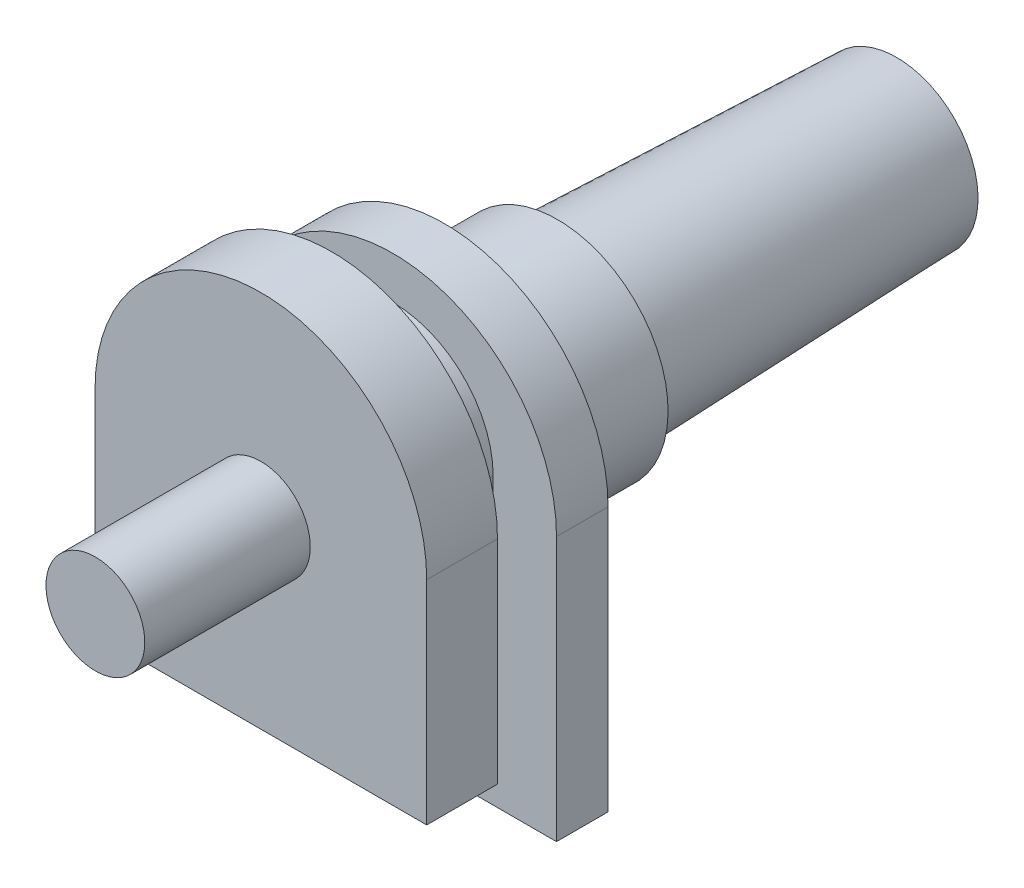
ISO-10303-21;
HEADER;
FILE_DESCRIPTION(('STEP AP214'),'2;1');
FILE_NAME('part.step','',(''),(''),'','','');
FILE_SCHEMA(('AUTOMOTIVE_DESIGN { 1 0 10303 214 1 1 1 1 }'));
ENDSEC;
DATA;
#1=APPLICATION_CONTEXT('core data for automotive mechanical design processes');
#2=APPLICATION_PROTOCOL_DEFINITION('international standard','automotive_design',2000,#1);
#3=PRODUCT_CONTEXT('',#1,'mechanical');
#4=PRODUCT('Part','Part','',(#3));
#5=PRODUCT_RELATED_PRODUCT_CATEGORY('part','',(#4));
#6=PRODUCT_DEFINITION_FORMATION('','',#4);
#7=PRODUCT_DEFINITION_CONTEXT('part definition',#1,'design');
#8=PRODUCT_DEFINITION('design','',#6,#7);
#9=PRODUCT_DEFINITION_SHAPE('','',#8);
#10=(LENGTH_UNIT() NAMED_UNIT(*) SI_UNIT(.MILLI.,.METRE.));
#11=(NAMED_UNIT(*) PLANE_ANGLE_UNIT() SI_UNIT($,.RADIAN.));
#12=(NAMED_UNIT(*) SI_UNIT($,.STERADIAN.) SOLID_ANGLE_UNIT());
#13=UNCERTAINTY_MEASURE_WITH_UNIT(LENGTH_MEASURE(1.E-05),#10,'distance_accuracy_value','');
#14=(GEOMETRIC_REPRESENTATION_CONTEXT(3) GLOBAL_UNCERTAINTY_ASSIGNED_CONTEXT((#13)) GLOBAL_UNIT_ASSIGNED_CONTEXT((#10,
#11,#12)) REPRESENTATION_CONTEXT('',''));
#15=CARTESIAN_POINT('',(0.,0.,0.));
#16=DIRECTION('',(0.,0.,1.));
#17=DIRECTION('',(1.,0.,0.));
#18=AXIS2_PLACEMENT_3D('',#15,#16,#17);
#19=CARTESIAN_POINT('',(0.,0.,0.));
#20=DIRECTION('',(0.,0.,1.));
#21=DIRECTION('',(1.,0.,0.));
#22=AXIS2_PLACEMENT_3D('',#19,#20,#21);
#23=PLANE('',#22);
#24=CARTESIAN_POINT('',(0.,0.,0.));
#25=DIRECTION('',(0.,0.,1.));
#26=DIRECTION('',(1.,0.,0.));
#27=AXIS2_PLACEMENT_3D('',#24,#25,#26);
#28=CIRCLE('',#27,7.335);
#29=CARTESIAN_POINT('',(7.335,0.,0.));
#30=VERTEX_POINT('',#29);
#31=CARTESIAN_POINT('',(-7.335,0.,0.));
#32=VERTEX_POINT('',#31);
#33=EDGE_CURVE('E191',#30,#32,#28,.T.);
#34=ORIENTED_EDGE('',*,*,#33,.F.);
#35=DIRECTION('',(0.,1.,0.));
#36=VECTOR('',#35,1.);
#37=CARTESIAN_POINT('',(7.335,-9.395,0.));
#38=LINE('',#37,#36);
#39=CARTESIAN_POINT('',(7.335,-9.395,0.));
#40=VERTEX_POINT('',#39);
#41=EDGE_CURVE('E196',#40,#30,#38,.T.);
#42=ORIENTED_EDGE('',*,*,#41,.F.);
#43=DIRECTION('',(1.,0.,0.));
#44=VECTOR('',#43,1.);
#45=CARTESIAN_POINT('',(-7.335,-9.395,0.));
#46=LINE('',#45,#44);
#47=CARTESIAN_POINT('',(-7.335,-9.395,0.));
#48=VERTEX_POINT('',#47);
#49=EDGE_CURVE('E207',#48,#40,#46,.T.);
#50=ORIENTED_EDGE('',*,*,#49,.F.);
#51=DIRECTION('',(0.,-1.,0.));
#52=VECTOR('',#51,1.);
#53=CARTESIAN_POINT('',(-7.335,0.,0.));
#54=LINE('',#53,#52);
#55=EDGE_CURVE('E205',#32,#48,#54,.T.);
#56=ORIENTED_EDGE('',*,*,#55,.F.);
#57=EDGE_LOOP('',(#34,#42,#50,#56));
#58=FACE_BOUND('',#57,.T.);
#59=CARTESIAN_POINT('',(0.,-0.4,0.));
#60=DIRECTION('',(0.,0.,-1.));
#61=DIRECTION('',(-1.,0.,0.));
#62=AXIS2_PLACEMENT_3D('',#59,#60,#61);
#63=CIRCLE('',#62,4.435);
#64=CARTESIAN_POINT('',(-4.435,-0.4,0.));
#65=VERTEX_POINT('',#64);
#66=CARTESIAN_POINT('',(4.435,-0.4,0.));
#67=VERTEX_POINT('',#66);
#68=EDGE_CURVE('E58',#65,#67,#63,.T.);
#69=ORIENTED_EDGE('',*,*,#68,.F.);
#70=DIRECTION('',(0.,1.,0.));
#71=VECTOR('',#70,1.);
#72=CARTESIAN_POINT('',(-4.435,-6.755,0.));
#73=LINE('',#72,#71);
#74=CARTESIAN_POINT('',(-4.435,-6.755,0.));
#75=VERTEX_POINT('',#74);
#76=EDGE_CURVE('E62',#75,#65,#73,.T.);
#77=ORIENTED_EDGE('',*,*,#76,.F.);
#78=DIRECTION('',(-1.,0.,0.));
#79=VECTOR('',#78,1.);
#80=CARTESIAN_POINT('',(4.435,-6.755,0.));
#81=LINE('',#80,#79);
#82=CARTESIAN_POINT('',(4.435,-6.755,0.));
#83=VERTEX_POINT('',#82);
#84=EDGE_CURVE('E177',#83,#75,#81,.T.);
#85=ORIENTED_EDGE('',*,*,#84,.F.);
#86=DIRECTION('',(0.,-1.,0.));
#87=VECTOR('',#86,1.);
#88=CARTESIAN_POINT('',(4.435,-0.4,0.));
#89=LINE('',#88,#87);
#90=EDGE_CURVE('E156',#67,#83,#89,.T.);
#91=ORIENTED_EDGE('',*,*,#90,.F.);
#92=EDGE_LOOP('',(#69,#77,#85,#91));
#93=FACE_BOUND('',#92,.T.);
#94=ADVANCED_FACE('F43',(#58,#93),#23,.F.);
#95=CARTESIAN_POINT('',(0.,0.,3.13));
#96=DIRECTION('',(0.,0.,-1.));
#97=DIRECTION('',(-1.,0.,0.));
#98=AXIS2_PLACEMENT_3D('',#95,#96,#97);
#99=CYLINDRICAL_SURFACE('',#98,7.335);
#100=ORIENTED_EDGE('',*,*,#33,.T.);
#101=DIRECTION('',(0.,0.,-1.));
#102=VECTOR('',#101,1.);
#103=CARTESIAN_POINT('',(-7.335,0.,3.13));
#104=LINE('',#103,#102);
#105=CARTESIAN_POINT('',(-7.335,0.,3.13));
#106=VERTEX_POINT('',#105);
#107=EDGE_CURVE('E11',#106,#32,#104,.T.);
#108=ORIENTED_EDGE('',*,*,#107,.F.);
#109=CARTESIAN_POINT('',(0.,0.,3.13));
#110=DIRECTION('',(0.,0.,1.));
#111=DIRECTION('',(1.,0.,0.));
#112=AXIS2_PLACEMENT_3D('',#109,#110,#111);
#113=CIRCLE('',#112,7.335);
#114=CARTESIAN_POINT('',(7.335,0.,3.13));
#115=VERTEX_POINT('',#114);
#116=EDGE_CURVE('E192',#115,#106,#113,.T.);
#117=ORIENTED_EDGE('',*,*,#116,.F.);
#118=DIRECTION('',(0.,0.,-1.));
#119=VECTOR('',#118,1.);
#120=CARTESIAN_POINT('',(7.335,0.,3.13));
#121=LINE('',#120,#119);
#122=EDGE_CURVE('E202',#115,#30,#121,.T.);
#123=ORIENTED_EDGE('',*,*,#122,.T.);
#124=EDGE_LOOP('',(#100,#108,#117,#123));
#125=FACE_BOUND('',#124,.T.);
#126=ADVANCED_FACE('F45',(#125),#99,.T.);
#127=CARTESIAN_POINT('',(-7.335,0.,3.13));
#128=DIRECTION('',(1.,0.,0.));
#129=DIRECTION('',(0.,0.,-1.));
#130=AXIS2_PLACEMENT_3D('',#127,#128,#129);
#131=PLANE('',#130);
#132=ORIENTED_EDGE('',*,*,#55,.T.);
#133=DIRECTION('',(0.,0.,-1.));
#134=VECTOR('',#133,1.);
#135=CARTESIAN_POINT('',(-7.335,-9.395,3.13));
#136=LINE('',#135,#134);
#137=CARTESIAN_POINT('',(-7.335,-9.395,3.13));
#138=VERTEX_POINT('',#137);
#139=EDGE_CURVE('E51',#138,#48,#136,.T.);
#140=ORIENTED_EDGE('',*,*,#139,.F.);
#141=DIRECTION('',(0.,-1.,0.));
#142=VECTOR('',#141,1.);
#143=CARTESIAN_POINT('',(-7.335,0.,3.13));
#144=LINE('',#143,#142);
#145=EDGE_CURVE('E195',#106,#138,#144,.T.);
#146=ORIENTED_EDGE('',*,*,#145,.F.);
#147=ORIENTED_EDGE('',*,*,#107,.T.);
#148=EDGE_LOOP('',(#132,#140,#146,#147));
#149=FACE_BOUND('',#148,.T.);
#150=ADVANCED_FACE('F234',(#149),#131,.F.);
#151=CARTESIAN_POINT('',(-7.335,-9.395,3.13));
#152=DIRECTION('',(0.,1.,0.));
#153=DIRECTION('',(0.,0.,1.));
#154=AXIS2_PLACEMENT_3D('',#151,#152,#153);
#155=PLANE('',#154);
#156=ORIENTED_EDGE('',*,*,#49,.T.);
#157=DIRECTION('',(0.,0.,-1.));
#158=VECTOR('',#157,1.);
#159=CARTESIAN_POINT('',(7.335,-9.395,3.13));
#160=LINE('',#159,#158);
#161=CARTESIAN_POINT('',(7.335,-9.395,3.13));
#162=VERTEX_POINT('',#161);
#163=EDGE_CURVE('E212',#162,#40,#160,.T.);
#164=ORIENTED_EDGE('',*,*,#163,.F.);
#165=DIRECTION('',(1.,0.,0.));
#166=VECTOR('',#165,1.);
#167=CARTESIAN_POINT('',(-7.335,-9.395,3.13));
#168=LINE('',#167,#166);
#169=EDGE_CURVE('E198',#138,#162,#168,.T.);
#170=ORIENTED_EDGE('',*,*,#169,.F.);
#171=ORIENTED_EDGE('',*,*,#139,.T.);
#172=EDGE_LOOP('',(#156,#164,#170,#171));
#173=FACE_BOUND('',#172,.T.);
#174=ADVANCED_FACE('F219',(#173),#155,.F.);
#175=CARTESIAN_POINT('',(7.335,-9.395,3.13));
#176=DIRECTION('',(-1.,0.,0.));
#177=DIRECTION('',(0.,0.,1.));
#178=AXIS2_PLACEMENT_3D('',#175,#176,#177);
#179=PLANE('',#178);
#180=ORIENTED_EDGE('',*,*,#41,.T.);
#181=ORIENTED_EDGE('',*,*,#122,.F.);
#182=DIRECTION('',(0.,1.,0.));
#183=VECTOR('',#182,1.);
#184=CARTESIAN_POINT('',(7.335,-9.395,3.13));
#185=LINE('',#184,#183);
#186=EDGE_CURVE('E200',#162,#115,#185,.T.);
#187=ORIENTED_EDGE('',*,*,#186,.F.);
#188=ORIENTED_EDGE('',*,*,#163,.T.);
#189=EDGE_LOOP('',(#180,#181,#187,#188));
#190=FACE_BOUND('',#189,.T.);
#191=ADVANCED_FACE('F227',(#190),#179,.F.);
#192=CARTESIAN_POINT('',(0.,0.,3.13));
#193=DIRECTION('',(0.,0.,1.));
#194=DIRECTION('',(1.,0.,0.));
#195=AXIS2_PLACEMENT_3D('',#192,#193,#194);
#196=PLANE('',#195);
#197=CARTESIAN_POINT('',(0.,-1.32,3.13));
#198=DIRECTION('',(0.,0.,-1.));
#199=DIRECTION('',(0.,1.,0.));
#200=AXIS2_PLACEMENT_3D('',#197,#198,#199);
#201=CIRCLE('',#200,2.185);
#202=CARTESIAN_POINT('',(0.,0.865000000000004,3.13));
#203=VERTEX_POINT('',#202);
#204=EDGE_CURVE('E261',#203,#203,#201,.T.);
#205=ORIENTED_EDGE('',*,*,#204,.T.);
#206=EDGE_LOOP('',(#205));
#207=FACE_BOUND('',#206,.T.);
#208=ORIENTED_EDGE('',*,*,#116,.T.);
#209=ORIENTED_EDGE('',*,*,#145,.T.);
#210=ORIENTED_EDGE('',*,*,#169,.T.);
#211=ORIENTED_EDGE('',*,*,#186,.T.);
#212=EDGE_LOOP('',(#208,#209,#210,#211));
#213=FACE_BOUND('',#212,.T.);
#214=ADVANCED_FACE('F233',(#207,#213),#196,.T.);
#215=CARTESIAN_POINT('',(0.,-0.4,-2.71));
#216=DIRECTION('',(0.,0.,1.));
#217=DIRECTION('',(1.,0.,0.));
#218=AXIS2_PLACEMENT_3D('',#215,#216,#217);
#219=CYLINDRICAL_SURFACE('',#218,4.435);
#220=ORIENTED_EDGE('',*,*,#68,.T.);
#221=DIRECTION('',(0.,0.,1.));
#222=VECTOR('',#221,1.);
#223=CARTESIAN_POINT('',(4.435,-0.4,-2.71));
#224=LINE('',#223,#222);
#225=CARTESIAN_POINT('',(4.435,-0.4,-2.71));
#226=VERTEX_POINT('',#225);
#227=EDGE_CURVE('E188',#226,#67,#224,.T.);
#228=ORIENTED_EDGE('',*,*,#227,.F.);
#229=CARTESIAN_POINT('',(0.,-0.4,-2.71));
#230=DIRECTION('',(0.,0.,-1.));
#231=DIRECTION('',(-1.,0.,0.));
#232=AXIS2_PLACEMENT_3D('',#229,#230,#231);
#233=CIRCLE('',#232,4.435);
#234=CARTESIAN_POINT('',(-4.435,-0.4,-2.71));
#235=VERTEX_POINT('',#234);
#236=EDGE_CURVE('E162',#235,#226,#233,.T.);
#237=ORIENTED_EDGE('',*,*,#236,.F.);
#238=DIRECTION('',(0.,0.,1.));
#239=VECTOR('',#238,1.);
#240=CARTESIAN_POINT('',(-4.435,-0.4,-2.71));
#241=LINE('',#240,#239);
#242=EDGE_CURVE('E173',#235,#65,#241,.T.);
#243=ORIENTED_EDGE('',*,*,#242,.T.);
#244=EDGE_LOOP('',(#220,#228,#237,#243));
#245=FACE_BOUND('',#244,.T.);
#246=ADVANCED_FACE('F252',(#245),#219,.T.);
#247=CARTESIAN_POINT('',(4.435,-0.4,-2.71));
#248=DIRECTION('',(-1.,0.,0.));
#249=DIRECTION('',(0.,-1.,0.));
#250=AXIS2_PLACEMENT_3D('',#247,#248,#249);
#251=PLANE('',#250);
#252=ORIENTED_EDGE('',*,*,#90,.T.);
#253=DIRECTION('',(0.,0.,1.));
#254=VECTOR('',#253,1.);
#255=CARTESIAN_POINT('',(4.435,-6.755,-2.71));
#256=LINE('',#255,#254);
#257=CARTESIAN_POINT('',(4.435,-6.755,-2.71));
#258=VERTEX_POINT('',#257);
#259=EDGE_CURVE('E185',#258,#83,#256,.T.);
#260=ORIENTED_EDGE('',*,*,#259,.F.);
#261=DIRECTION('',(0.,-1.,0.));
#262=VECTOR('',#261,1.);
#263=CARTESIAN_POINT('',(4.435,-0.4,-2.71));
#264=LINE('',#263,#262);
#265=EDGE_CURVE('E165',#226,#258,#264,.T.);
#266=ORIENTED_EDGE('',*,*,#265,.F.);
#267=ORIENTED_EDGE('',*,*,#227,.T.);
#268=EDGE_LOOP('',(#252,#260,#266,#267));
#269=FACE_BOUND('',#268,.T.);
#270=ADVANCED_FACE('F257',(#269),#251,.F.);
#271=CARTESIAN_POINT('',(4.435,-6.755,-2.71));
#272=DIRECTION('',(0.,1.,0.));
#273=DIRECTION('',(-1.,0.,0.));
#274=AXIS2_PLACEMENT_3D('',#271,#272,#273);
#275=PLANE('',#274);
#276=ORIENTED_EDGE('',*,*,#84,.T.);
#277=DIRECTION('',(0.,0.,1.));
#278=VECTOR('',#277,1.);
#279=CARTESIAN_POINT('',(-4.435,-6.755,-2.71));
#280=LINE('',#279,#278);
#281=CARTESIAN_POINT('',(-4.435,-6.755,-2.71));
#282=VERTEX_POINT('',#281);
#283=EDGE_CURVE('E182',#282,#75,#280,.T.);
#284=ORIENTED_EDGE('',*,*,#283,.F.);
#285=DIRECTION('',(-1.,0.,0.));
#286=VECTOR('',#285,1.);
#287=CARTESIAN_POINT('',(4.435,-6.755,-2.71));
#288=LINE('',#287,#286);
#289=EDGE_CURVE('E168',#258,#282,#288,.T.);
#290=ORIENTED_EDGE('',*,*,#289,.F.);
#291=ORIENTED_EDGE('',*,*,#259,.T.);
#292=EDGE_LOOP('',(#276,#284,#290,#291));
#293=FACE_BOUND('',#292,.T.);
#294=ADVANCED_FACE('F315',(#293),#275,.F.);
#295=CARTESIAN_POINT('',(-4.435,-6.755,-2.71));
#296=DIRECTION('',(1.,0.,0.));
#297=DIRECTION('',(0.,1.,0.));
#298=AXIS2_PLACEMENT_3D('',#295,#296,#297);
#299=PLANE('',#298);
#300=ORIENTED_EDGE('',*,*,#76,.T.);
#301=ORIENTED_EDGE('',*,*,#242,.F.);
#302=DIRECTION('',(0.,1.,0.));
#303=VECTOR('',#302,1.);
#304=CARTESIAN_POINT('',(-4.435,-6.755,-2.71));
#305=LINE('',#304,#303);
#306=EDGE_CURVE('E171',#282,#235,#305,.T.);
#307=ORIENTED_EDGE('',*,*,#306,.F.);
#308=ORIENTED_EDGE('',*,*,#283,.T.);
#309=EDGE_LOOP('',(#300,#301,#307,#308));
#310=FACE_BOUND('',#309,.T.);
#311=ADVANCED_FACE('F312',(#310),#299,.F.);
#312=CARTESIAN_POINT('',(0.,-1.32,-2.71));
#313=DIRECTION('',(0.,0.,-1.));
#314=DIRECTION('',(-1.,0.,0.));
#315=AXIS2_PLACEMENT_3D('',#312,#313,#314);
#316=PLANE('',#315);
#317=DIRECTION('',(0.,-1.,0.));
#318=VECTOR('',#317,1.);
#319=CARTESIAN_POINT('',(7.235,-1.32000000000001,-2.71));
#320=LINE('',#319,#318);
#321=CARTESIAN_POINT('',(7.235,-1.32,-2.71));
#322=VERTEX_POINT('',#321);
#323=CARTESIAN_POINT('',(7.235,-13.005,-2.71));
#324=VERTEX_POINT('',#323);
#325=EDGE_CURVE('E154',#322,#324,#320,.T.);
#326=ORIENTED_EDGE('',*,*,#325,.F.);
#327=CARTESIAN_POINT('',(0.,-1.32,-2.71));
#328=DIRECTION('',(0.,0.,-1.));
#329=DIRECTION('',(-1.,0.,0.));
#330=AXIS2_PLACEMENT_3D('',#327,#328,#329);
#331=CIRCLE('',#330,7.235);
#332=CARTESIAN_POINT('',(-7.235,-1.32,-2.71));
#333=VERTEX_POINT('',#332);
#334=EDGE_CURVE('E150',#333,#322,#331,.T.);
#335=ORIENTED_EDGE('',*,*,#334,.F.);
#336=DIRECTION('',(0.,1.,0.));
#337=VECTOR('',#336,1.);
#338=CARTESIAN_POINT('',(-7.235,-13.005,-2.71));
#339=LINE('',#338,#337);
#340=CARTESIAN_POINT('',(-7.235,-13.005,-2.71));
#341=VERTEX_POINT('',#340);
#342=EDGE_CURVE('E286',#341,#333,#339,.T.);
#343=ORIENTED_EDGE('',*,*,#342,.F.);
#344=DIRECTION('',(-1.,0.,0.));
#345=VECTOR('',#344,1.);
#346=CARTESIAN_POINT('',(7.235,-13.005,-2.71));
#347=LINE('',#346,#345);
#348=EDGE_CURVE('E284',#324,#341,#347,.T.);
#349=ORIENTED_EDGE('',*,*,#348,.F.);
#350=EDGE_LOOP('',(#326,#335,#343,#349));
#351=FACE_BOUND('',#350,.T.);
#352=ORIENTED_EDGE('',*,*,#306,.T.);
#353=ORIENTED_EDGE('',*,*,#236,.T.);
#354=ORIENTED_EDGE('',*,*,#265,.T.);
#355=ORIENTED_EDGE('',*,*,#289,.T.);
#356=EDGE_LOOP('',(#352,#353,#354,#355));
#357=FACE_BOUND('',#356,.T.);
#358=ADVANCED_FACE('F297',(#351,#357),#316,.F.);
#359=CARTESIAN_POINT('',(7.235,-1.32000000000001,-4.99));
#360=DIRECTION('',(-1.,0.,0.));
#361=DIRECTION('',(0.,-1.,0.));
#362=AXIS2_PLACEMENT_3D('',#359,#360,#361);
#363=PLANE('',#362);
#364=ORIENTED_EDGE('',*,*,#325,.T.);
#365=DIRECTION('',(0.,0.,1.));
#366=VECTOR('',#365,1.);
#367=CARTESIAN_POINT('',(7.235,-13.005,-4.99));
#368=LINE('',#367,#366);
#369=CARTESIAN_POINT('',(7.235,-13.005,-4.99));
#370=VERTEX_POINT('',#369);
#371=EDGE_CURVE('E134',#370,#324,#368,.T.);
#372=ORIENTED_EDGE('',*,*,#371,.F.);
#373=DIRECTION('',(0.,-1.,0.));
#374=VECTOR('',#373,1.);
#375=CARTESIAN_POINT('',(7.235,-1.32000000000001,-4.99));
#376=LINE('',#375,#374);
#377=CARTESIAN_POINT('',(7.235,-1.32,-4.99));
#378=VERTEX_POINT('',#377);
#379=EDGE_CURVE('E141',#378,#370,#376,.T.);
#380=ORIENTED_EDGE('',*,*,#379,.F.);
#381=DIRECTION('',(0.,0.,1.));
#382=VECTOR('',#381,1.);
#383=CARTESIAN_POINT('',(7.235,-1.32,-4.99));
#384=LINE('',#383,#382);
#385=EDGE_CURVE('E282',#378,#322,#384,.T.);
#386=ORIENTED_EDGE('',*,*,#385,.T.);
#387=EDGE_LOOP('',(#364,#372,#380,#386));
#388=FACE_BOUND('',#387,.T.);
#389=ADVANCED_FACE('F152',(#388),#363,.F.);
#390=CARTESIAN_POINT('',(7.235,-13.005,-4.99));
#391=DIRECTION('',(0.,1.,0.));
#392=DIRECTION('',(0.,0.,1.));
#393=AXIS2_PLACEMENT_3D('',#390,#391,#392);
#394=PLANE('',#393);
#395=ORIENTED_EDGE('',*,*,#348,.T.);
#396=DIRECTION('',(0.,0.,1.));
#397=VECTOR('',#396,1.);
#398=CARTESIAN_POINT('',(-7.235,-13.005,-4.99));
#399=LINE('',#398,#397);
#400=CARTESIAN_POINT('',(-7.235,-13.005,-4.99));
#401=VERTEX_POINT('',#400);
#402=EDGE_CURVE('E137',#401,#341,#399,.T.);
#403=ORIENTED_EDGE('',*,*,#402,.F.);
#404=DIRECTION('',(-1.,0.,0.));
#405=VECTOR('',#404,1.);
#406=CARTESIAN_POINT('',(7.235,-13.005,-4.99));
#407=LINE('',#406,#405);
#408=EDGE_CURVE('E130',#370,#401,#407,.T.);
#409=ORIENTED_EDGE('',*,*,#408,.F.);
#410=ORIENTED_EDGE('',*,*,#371,.T.);
#411=EDGE_LOOP('',(#395,#403,#409,#410));
#412=FACE_BOUND('',#411,.T.);
#413=ADVANCED_FACE('F132',(#412),#394,.F.);
#414=CARTESIAN_POINT('',(-7.235,-13.005,-4.99));
#415=DIRECTION('',(1.,0.,0.));
#416=DIRECTION('',(0.,1.,0.));
#417=AXIS2_PLACEMENT_3D('',#414,#415,#416);
#418=PLANE('',#417);
#419=ORIENTED_EDGE('',*,*,#342,.T.);
#420=DIRECTION('',(0.,0.,1.));
#421=VECTOR('',#420,1.);
#422=CARTESIAN_POINT('',(-7.235,-1.32,-4.99));
#423=LINE('',#422,#421);
#424=CARTESIAN_POINT('',(-7.235,-1.32,-4.99));
#425=VERTEX_POINT('',#424);
#426=EDGE_CURVE('E158',#425,#333,#423,.T.);
#427=ORIENTED_EDGE('',*,*,#426,.F.);
#428=DIRECTION('',(0.,1.,0.));
#429=VECTOR('',#428,1.);
#430=CARTESIAN_POINT('',(-7.235,-13.005,-4.99));
#431=LINE('',#430,#429);
#432=EDGE_CURVE('E140',#401,#425,#431,.T.);
#433=ORIENTED_EDGE('',*,*,#432,.F.);
#434=ORIENTED_EDGE('',*,*,#402,.T.);
#435=EDGE_LOOP('',(#419,#427,#433,#434));
#436=FACE_BOUND('',#435,.T.);
#437=ADVANCED_FACE('F299',(#436),#418,.F.);
#438=CARTESIAN_POINT('',(0.,-1.32,-4.99));
#439=DIRECTION('',(0.,0.,1.));
#440=DIRECTION('',(1.,0.,0.));
#441=AXIS2_PLACEMENT_3D('',#438,#439,#440);
#442=CYLINDRICAL_SURFACE('',#441,7.235);
#443=ORIENTED_EDGE('',*,*,#334,.T.);
#444=ORIENTED_EDGE('',*,*,#385,.F.);
#445=CARTESIAN_POINT('',(0.,-1.32,-4.99));
#446=DIRECTION('',(0.,0.,-1.));
#447=DIRECTION('',(-1.,0.,0.));
#448=AXIS2_PLACEMENT_3D('',#445,#446,#447);
#449=CIRCLE('',#448,7.235);
#450=EDGE_CURVE('E146',#425,#378,#449,.T.);
#451=ORIENTED_EDGE('',*,*,#450,.F.);
#452=ORIENTED_EDGE('',*,*,#426,.T.);
#453=EDGE_LOOP('',(#443,#444,#451,#452));
#454=FACE_BOUND('',#453,.T.);
#455=ADVANCED_FACE('F293',(#454),#442,.T.);
#456=CARTESIAN_POINT('',(0.,-1.32,-4.99));
#457=DIRECTION('',(0.,0.,-1.));
#458=DIRECTION('',(-1.,0.,0.));
#459=AXIS2_PLACEMENT_3D('',#456,#457,#458);
#460=PLANE('',#459);
#461=CARTESIAN_POINT('',(0.,-1.32,-4.99));
#462=DIRECTION('',(0.,0.,1.));
#463=DIRECTION('',(0.,-1.,0.));
#464=AXIS2_PLACEMENT_3D('',#461,#462,#463);
#465=CIRCLE('',#464,4.88999999999999);
#466=CARTESIAN_POINT('',(0.,-6.20999999999999,-4.99));
#467=VERTEX_POINT('',#466);
#468=EDGE_CURVE('E277',#467,#467,#465,.T.);
#469=ORIENTED_EDGE('',*,*,#468,.T.);
#470=EDGE_LOOP('',(#469));
#471=FACE_BOUND('',#470,.T.);
#472=ORIENTED_EDGE('',*,*,#379,.T.);
#473=ORIENTED_EDGE('',*,*,#408,.T.);
#474=ORIENTED_EDGE('',*,*,#432,.T.);
#475=ORIENTED_EDGE('',*,*,#450,.T.);
#476=EDGE_LOOP('',(#472,#473,#474,#475));
#477=FACE_BOUND('',#476,.T.);
#478=ADVANCED_FACE('F144',(#471,#477),#460,.T.);
#479=CARTESIAN_POINT('',(0.,-1.32,-24.99));
#480=DIRECTION('',(0.,0.,1.));
#481=DIRECTION('',(0.,-1.,0.));
#482=AXIS2_PLACEMENT_3D('',#479,#480,#481);
#483=CYLINDRICAL_SURFACE('',#482,4.88999999999999);
#484=ORIENTED_EDGE('',*,*,#468,.F.);
#485=EDGE_LOOP('',(#484));
#486=FACE_BOUND('',#485,.T.);
#487=CARTESIAN_POINT('',(0.,-1.32,-9.99));
#488=DIRECTION('',(0.,0.,1.));
#489=DIRECTION('',(0.,-1.,0.));
#490=AXIS2_PLACEMENT_3D('',#487,#488,#489);
#491=CIRCLE('',#490,4.88999999999999);
#492=CARTESIAN_POINT('',(0.,-6.20999999999999,-9.98999999999999));
#493=VERTEX_POINT('',#492);
#494=EDGE_CURVE('E274',#493,#493,#491,.T.);
#495=ORIENTED_EDGE('',*,*,#494,.T.);
#496=EDGE_LOOP('',(#495));
#497=FACE_BOUND('',#496,.T.);
#498=ADVANCED_FACE('F334',(#486,#497),#483,.T.);
#499=CARTESIAN_POINT('',(0.,3.57,-9.99));
#500=DIRECTION('',(0.,0.,1.));
#501=DIRECTION('',(0.,-1.,0.));
#502=AXIS2_PLACEMENT_3D('',#499,#500,#501);
#503=PLANE('',#502);
#504=ORIENTED_EDGE('',*,*,#494,.F.);
#505=EDGE_LOOP('',(#504));
#506=FACE_BOUND('',#505,.T.);
#507=CARTESIAN_POINT('',(0.,-1.32,-9.99));
#508=DIRECTION('',(0.,0.,1.));
#509=DIRECTION('',(0.,-1.,0.));
#510=AXIS2_PLACEMENT_3D('',#507,#508,#509);
#511=CIRCLE('',#510,4.13499999999999);
#512=CARTESIAN_POINT('',(0.,-5.45499999999999,-9.98999999999999));
#513=VERTEX_POINT('',#512);
#514=EDGE_CURVE('E267',#513,#513,#511,.T.);
#515=ORIENTED_EDGE('',*,*,#514,.T.);
#516=EDGE_LOOP('',(#515));
#517=FACE_BOUND('',#516,.T.);
#518=ADVANCED_FACE('F338',(#506,#517),#503,.F.);
#519=CARTESIAN_POINT('',(0.,-1.32,-24.99));
#520=DIRECTION('',(0.,0.,1.));
#521=DIRECTION('',(0.,-1.,0.));
#522=AXIS2_PLACEMENT_3D('',#519,#520,#521);
#523=CONICAL_SURFACE('',#522,3.6,0.0356515542121689);
#524=ORIENTED_EDGE('',*,*,#514,.F.);
#525=EDGE_LOOP('',(#524));
#526=FACE_BOUND('',#525,.T.);
#527=CARTESIAN_POINT('',(0.,-1.32,-24.99));
#528=DIRECTION('',(0.,0.,1.));
#529=DIRECTION('',(0.,-1.,0.));
#530=AXIS2_PLACEMENT_3D('',#527,#528,#529);
#531=CIRCLE('',#530,3.6);
#532=CARTESIAN_POINT('',(0.,-4.92,-24.99));
#533=VERTEX_POINT('',#532);
#534=EDGE_CURVE('E263',#533,#533,#531,.T.);
#535=ORIENTED_EDGE('',*,*,#534,.T.);
#536=EDGE_LOOP('',(#535));
#537=FACE_BOUND('',#536,.T.);
#538=ADVANCED_FACE('F342',(#526,#537),#523,.T.);
#539=CARTESIAN_POINT('',(0.,2.28,-24.99));
#540=DIRECTION('',(0.,0.,1.));
#541=DIRECTION('',(0.,-1.,0.));
#542=AXIS2_PLACEMENT_3D('',#539,#540,#541);
#543=PLANE('',#542);
#544=ORIENTED_EDGE('',*,*,#534,.F.);
#545=EDGE_LOOP('',(#544));
#546=FACE_BOUND('',#545,.T.);
#547=ADVANCED_FACE('F346',(#546),#543,.F.);
#548=CARTESIAN_POINT('',(0.,-1.32,10.4501642662188));
#549=DIRECTION('',(0.,0.,-1.));
#550=DIRECTION('',(0.,1.,0.));
#551=AXIS2_PLACEMENT_3D('',#548,#549,#550);
#552=CYLINDRICAL_SURFACE('',#551,2.185);
#553=CARTESIAN_POINT('',(0.,-1.32,10.4501642662188));
#554=DIRECTION('',(0.,0.,-1.));
#555=DIRECTION('',(0.,1.,0.));
#556=AXIS2_PLACEMENT_3D('',#553,#554,#555);
#557=CIRCLE('',#556,2.185);
#558=CARTESIAN_POINT('',(0.,0.865000000000004,10.4501642662188));
#559=VERTEX_POINT('',#558);
#560=EDGE_CURVE('E264',#559,#559,#557,.T.);
#561=ORIENTED_EDGE('',*,*,#560,.T.);
#562=EDGE_LOOP('',(#561));
#563=FACE_BOUND('',#562,.T.);
#564=ORIENTED_EDGE('',*,*,#204,.F.);
#565=EDGE_LOOP('',(#564));
#566=FACE_BOUND('',#565,.T.);
#567=ADVANCED_FACE('F350',(#563,#566),#552,.T.);
#568=CARTESIAN_POINT('',(0.,0.865000000000004,10.4501642662188));
#569=DIRECTION('',(0.,0.,1.));
#570=DIRECTION('',(0.,-1.,0.));
#571=AXIS2_PLACEMENT_3D('',#568,#569,#570);
#572=PLANE('',#571);
#573=ORIENTED_EDGE('',*,*,#560,.F.);
#574=EDGE_LOOP('',(#573));
#575=FACE_BOUND('',#574,.T.);
#576=ADVANCED_FACE('F354',(#575),#572,.T.);
#577=CLOSED_SHELL('',(#94,#126,#150,#174,#191,#214,#246,#270,#294,#311,#358,#389,#413,#437,#455,
#478,#498,#518,#538,#547,#567,#576));
#578=MANIFOLD_SOLID_BREP('B2',#577);
#579=ADVANCED_BREP_SHAPE_REPRESENTATION('',(#18,#578),#14);
#580=SHAPE_DEFINITION_REPRESENTATION(#9,#579);
ENDSEC;
END-ISO-10303-21;
